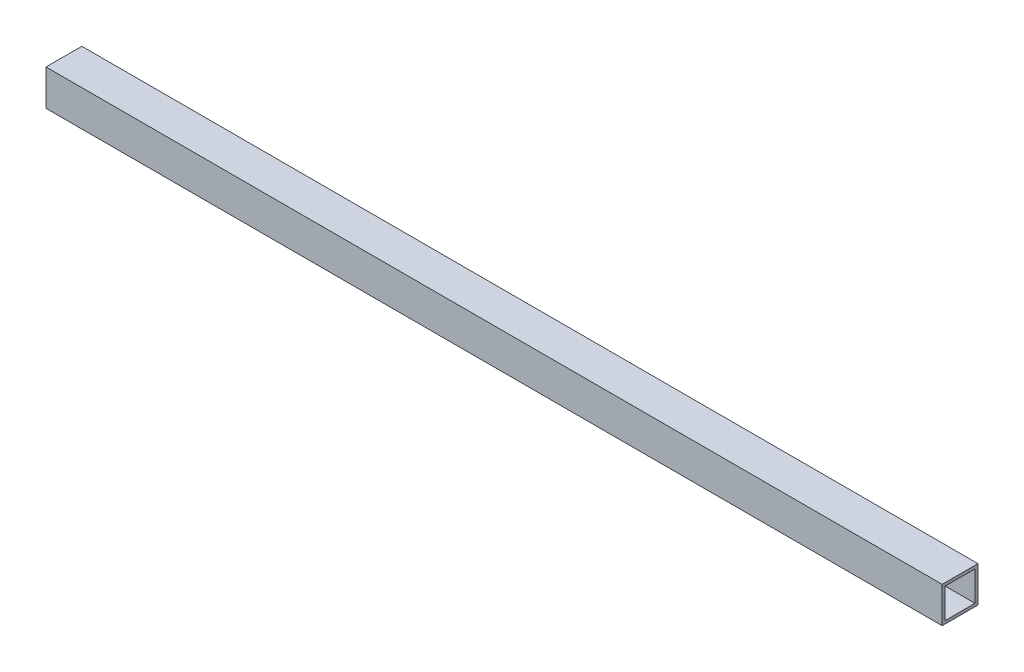
ISO-10303-21;
HEADER;
FILE_DESCRIPTION(('STEP AP214'),'2;1');
FILE_NAME('part.step','',(''),(''),'','','');
FILE_SCHEMA(('AUTOMOTIVE_DESIGN { 1 0 10303 214 1 1 1 1 }'));
ENDSEC;
DATA;
#1=APPLICATION_CONTEXT('core data for automotive mechanical design processes');
#2=APPLICATION_PROTOCOL_DEFINITION('international standard','automotive_design',2000,#1);
#3=PRODUCT_CONTEXT('',#1,'mechanical');
#4=PRODUCT('Part','Part','',(#3));
#5=PRODUCT_RELATED_PRODUCT_CATEGORY('part','',(#4));
#6=PRODUCT_DEFINITION_FORMATION('','',#4);
#7=PRODUCT_DEFINITION_CONTEXT('part definition',#1,'design');
#8=PRODUCT_DEFINITION('design','',#6,#7);
#9=PRODUCT_DEFINITION_SHAPE('','',#8);
#10=(LENGTH_UNIT() NAMED_UNIT(*) SI_UNIT(.MILLI.,.METRE.));
#11=(NAMED_UNIT(*) PLANE_ANGLE_UNIT() SI_UNIT($,.RADIAN.));
#12=(NAMED_UNIT(*) SI_UNIT($,.STERADIAN.) SOLID_ANGLE_UNIT());
#13=UNCERTAINTY_MEASURE_WITH_UNIT(LENGTH_MEASURE(1.E-05),#10,'distance_accuracy_value','');
#14=(GEOMETRIC_REPRESENTATION_CONTEXT(3) GLOBAL_UNCERTAINTY_ASSIGNED_CONTEXT((#13)) GLOBAL_UNIT_ASSIGNED_CONTEXT((#10,
#11,#12)) REPRESENTATION_CONTEXT('',''));
#15=CARTESIAN_POINT('',(0.,0.,0.));
#16=DIRECTION('',(0.,0.,1.));
#17=DIRECTION('',(1.,0.,0.));
#18=AXIS2_PLACEMENT_3D('',#15,#16,#17);
#19=CARTESIAN_POINT('',(600.,0.,0.));
#20=DIRECTION('',(1.,0.,0.));
#21=DIRECTION('',(0.,0.,-1.));
#22=AXIS2_PLACEMENT_3D('',#19,#20,#21);
#23=PLANE('',#22);
#24=DIRECTION('',(0.,0.,-1.));
#25=VECTOR('',#24,1.);
#26=CARTESIAN_POINT('',(600.,-12.,12.));
#27=LINE('',#26,#25);
#28=CARTESIAN_POINT('',(600.,-12.,12.));
#29=VERTEX_POINT('',#28);
#30=CARTESIAN_POINT('',(600.,-12.,-12.));
#31=VERTEX_POINT('',#30);
#32=EDGE_CURVE('E144',#29,#31,#27,.T.);
#33=ORIENTED_EDGE('',*,*,#32,.T.);
#34=DIRECTION('',(0.,1.,0.));
#35=VECTOR('',#34,1.);
#36=CARTESIAN_POINT('',(600.,-12.,-12.));
#37=LINE('',#36,#35);
#38=CARTESIAN_POINT('',(600.,12.,-12.));
#39=VERTEX_POINT('',#38);
#40=EDGE_CURVE('E147',#31,#39,#37,.T.);
#41=ORIENTED_EDGE('',*,*,#40,.T.);
#42=DIRECTION('',(0.,0.,1.));
#43=VECTOR('',#42,1.);
#44=CARTESIAN_POINT('',(600.,12.,12.));
#45=LINE('',#44,#43);
#46=CARTESIAN_POINT('',(600.,12.,12.));
#47=VERTEX_POINT('',#46);
#48=EDGE_CURVE('E150',#39,#47,#45,.T.);
#49=ORIENTED_EDGE('',*,*,#48,.T.);
#50=DIRECTION('',(0.,-1.,0.));
#51=VECTOR('',#50,1.);
#52=CARTESIAN_POINT('',(600.,-12.,12.));
#53=LINE('',#52,#51);
#54=EDGE_CURVE('E152',#47,#29,#53,.T.);
#55=ORIENTED_EDGE('',*,*,#54,.T.);
#56=EDGE_LOOP('',(#33,#41,#49,#55));
#57=FACE_BOUND('',#56,.T.);
#58=DIRECTION('',(0.,0.,1.));
#59=VECTOR('',#58,1.);
#60=CARTESIAN_POINT('',(600.,9.99999999999999,10.));
#61=LINE('',#60,#59);
#62=CARTESIAN_POINT('',(600.,9.99999999999999,-9.99999999999999));
#63=VERTEX_POINT('',#62);
#64=CARTESIAN_POINT('',(600.,9.99999999999999,10.));
#65=VERTEX_POINT('',#64);
#66=EDGE_CURVE('E116',#63,#65,#61,.T.);
#67=ORIENTED_EDGE('',*,*,#66,.F.);
#68=DIRECTION('',(0.,1.,0.));
#69=VECTOR('',#68,1.);
#70=CARTESIAN_POINT('',(600.,-10.,-9.99999999999999));
#71=LINE('',#70,#69);
#72=CARTESIAN_POINT('',(600.,-10.,-9.99999999999999));
#73=VERTEX_POINT('',#72);
#74=EDGE_CURVE('E108',#73,#63,#71,.T.);
#75=ORIENTED_EDGE('',*,*,#74,.F.);
#76=DIRECTION('',(0.,0.,-1.));
#77=VECTOR('',#76,1.);
#78=CARTESIAN_POINT('',(600.,-10.,10.));
#79=LINE('',#78,#77);
#80=CARTESIAN_POINT('',(600.,-10.,10.));
#81=VERTEX_POINT('',#80);
#82=EDGE_CURVE('E130',#81,#73,#79,.T.);
#83=ORIENTED_EDGE('',*,*,#82,.F.);
#84=DIRECTION('',(0.,-1.,0.));
#85=VECTOR('',#84,1.);
#86=CARTESIAN_POINT('',(600.,-10.,10.));
#87=LINE('',#86,#85);
#88=EDGE_CURVE('E128',#65,#81,#87,.T.);
#89=ORIENTED_EDGE('',*,*,#88,.F.);
#90=EDGE_LOOP('',(#67,#75,#83,#89));
#91=FACE_BOUND('',#90,.T.);
#92=ADVANCED_FACE('F43',(#57,#91),#23,.T.);
#93=CARTESIAN_POINT('',(0.,0.,0.));
#94=DIRECTION('',(1.,0.,0.));
#95=DIRECTION('',(0.,0.,-1.));
#96=AXIS2_PLACEMENT_3D('',#93,#94,#95);
#97=PLANE('',#96);
#98=DIRECTION('',(0.,0.,-1.));
#99=VECTOR('',#98,1.);
#100=CARTESIAN_POINT('',(0.,-12.,12.));
#101=LINE('',#100,#99);
#102=CARTESIAN_POINT('',(0.,-12.,12.));
#103=VERTEX_POINT('',#102);
#104=CARTESIAN_POINT('',(0.,-12.,-12.));
#105=VERTEX_POINT('',#104);
#106=EDGE_CURVE('E124',#103,#105,#101,.T.);
#107=ORIENTED_EDGE('',*,*,#106,.F.);
#108=DIRECTION('',(0.,-1.,0.));
#109=VECTOR('',#108,1.);
#110=CARTESIAN_POINT('',(0.,-12.,12.));
#111=LINE('',#110,#109);
#112=CARTESIAN_POINT('',(0.,12.,12.));
#113=VERTEX_POINT('',#112);
#114=EDGE_CURVE('E148',#113,#103,#111,.T.);
#115=ORIENTED_EDGE('',*,*,#114,.F.);
#116=DIRECTION('',(0.,0.,1.));
#117=VECTOR('',#116,1.);
#118=CARTESIAN_POINT('',(0.,12.,12.));
#119=LINE('',#118,#117);
#120=CARTESIAN_POINT('',(0.,12.,-12.));
#121=VERTEX_POINT('',#120);
#122=EDGE_CURVE('E159',#121,#113,#119,.T.);
#123=ORIENTED_EDGE('',*,*,#122,.F.);
#124=DIRECTION('',(0.,1.,0.));
#125=VECTOR('',#124,1.);
#126=CARTESIAN_POINT('',(0.,-12.,-12.));
#127=LINE('',#126,#125);
#128=EDGE_CURVE('E157',#105,#121,#127,.T.);
#129=ORIENTED_EDGE('',*,*,#128,.F.);
#130=EDGE_LOOP('',(#107,#115,#123,#129));
#131=FACE_BOUND('',#130,.T.);
#132=DIRECTION('',(0.,1.,0.));
#133=VECTOR('',#132,1.);
#134=CARTESIAN_POINT('',(0.,-10.,-9.99999999999999));
#135=LINE('',#134,#133);
#136=CARTESIAN_POINT('',(0.,-10.,-9.99999999999999));
#137=VERTEX_POINT('',#136);
#138=CARTESIAN_POINT('',(0.,9.99999999999999,-9.99999999999999));
#139=VERTEX_POINT('',#138);
#140=EDGE_CURVE('E66',#137,#139,#135,.T.);
#141=ORIENTED_EDGE('',*,*,#140,.T.);
#142=DIRECTION('',(0.,0.,1.));
#143=VECTOR('',#142,1.);
#144=CARTESIAN_POINT('',(0.,9.99999999999999,10.));
#145=LINE('',#144,#143);
#146=CARTESIAN_POINT('',(0.,9.99999999999999,10.));
#147=VERTEX_POINT('',#146);
#148=EDGE_CURVE('E123',#139,#147,#145,.T.);
#149=ORIENTED_EDGE('',*,*,#148,.T.);
#150=DIRECTION('',(0.,-1.,0.));
#151=VECTOR('',#150,1.);
#152=CARTESIAN_POINT('',(0.,-10.,10.));
#153=LINE('',#152,#151);
#154=CARTESIAN_POINT('',(0.,-10.,10.));
#155=VERTEX_POINT('',#154);
#156=EDGE_CURVE('E136',#147,#155,#153,.T.);
#157=ORIENTED_EDGE('',*,*,#156,.T.);
#158=DIRECTION('',(0.,0.,-1.));
#159=VECTOR('',#158,1.);
#160=CARTESIAN_POINT('',(0.,-10.,10.));
#161=LINE('',#160,#159);
#162=EDGE_CURVE('E117',#155,#137,#161,.T.);
#163=ORIENTED_EDGE('',*,*,#162,.T.);
#164=EDGE_LOOP('',(#141,#149,#157,#163));
#165=FACE_BOUND('',#164,.T.);
#166=ADVANCED_FACE('F177',(#131,#165),#97,.F.);
#167=CARTESIAN_POINT('',(600.,-12.,12.));
#168=DIRECTION('',(0.,1.,0.));
#169=DIRECTION('',(0.,0.,1.));
#170=AXIS2_PLACEMENT_3D('',#167,#168,#169);
#171=PLANE('',#170);
#172=ORIENTED_EDGE('',*,*,#106,.T.);
#173=DIRECTION('',(-1.,0.,0.));
#174=VECTOR('',#173,1.);
#175=CARTESIAN_POINT('',(600.,-12.,-12.));
#176=LINE('',#175,#174);
#177=EDGE_CURVE('E11',#31,#105,#176,.T.);
#178=ORIENTED_EDGE('',*,*,#177,.F.);
#179=ORIENTED_EDGE('',*,*,#32,.F.);
#180=DIRECTION('',(-1.,0.,0.));
#181=VECTOR('',#180,1.);
#182=CARTESIAN_POINT('',(600.,-12.,12.));
#183=LINE('',#182,#181);
#184=EDGE_CURVE('E154',#29,#103,#183,.T.);
#185=ORIENTED_EDGE('',*,*,#184,.T.);
#186=EDGE_LOOP('',(#172,#178,#179,#185));
#187=FACE_BOUND('',#186,.T.);
#188=ADVANCED_FACE('F45',(#187),#171,.F.);
#189=CARTESIAN_POINT('',(600.,-12.,-12.));
#190=DIRECTION('',(0.,0.,1.));
#191=DIRECTION('',(1.,0.,0.));
#192=AXIS2_PLACEMENT_3D('',#189,#190,#191);
#193=PLANE('',#192);
#194=ORIENTED_EDGE('',*,*,#128,.T.);
#195=DIRECTION('',(-1.,0.,0.));
#196=VECTOR('',#195,1.);
#197=CARTESIAN_POINT('',(600.,12.,-12.));
#198=LINE('',#197,#196);
#199=EDGE_CURVE('E51',#39,#121,#198,.T.);
#200=ORIENTED_EDGE('',*,*,#199,.F.);
#201=ORIENTED_EDGE('',*,*,#40,.F.);
#202=ORIENTED_EDGE('',*,*,#177,.T.);
#203=EDGE_LOOP('',(#194,#200,#201,#202));
#204=FACE_BOUND('',#203,.T.);
#205=ADVANCED_FACE('F187',(#204),#193,.F.);
#206=CARTESIAN_POINT('',(600.,12.,12.));
#207=DIRECTION('',(0.,-1.,0.));
#208=DIRECTION('',(0.,0.,-1.));
#209=AXIS2_PLACEMENT_3D('',#206,#207,#208);
#210=PLANE('',#209);
#211=ORIENTED_EDGE('',*,*,#122,.T.);
#212=DIRECTION('',(-1.,0.,0.));
#213=VECTOR('',#212,1.);
#214=CARTESIAN_POINT('',(600.,12.,12.));
#215=LINE('',#214,#213);
#216=EDGE_CURVE('E164',#47,#113,#215,.T.);
#217=ORIENTED_EDGE('',*,*,#216,.F.);
#218=ORIENTED_EDGE('',*,*,#48,.F.);
#219=ORIENTED_EDGE('',*,*,#199,.T.);
#220=EDGE_LOOP('',(#211,#217,#218,#219));
#221=FACE_BOUND('',#220,.T.);
#222=ADVANCED_FACE('F171',(#221),#210,.F.);
#223=CARTESIAN_POINT('',(600.,-12.,12.));
#224=DIRECTION('',(0.,0.,-1.));
#225=DIRECTION('',(-1.,0.,0.));
#226=AXIS2_PLACEMENT_3D('',#223,#224,#225);
#227=PLANE('',#226);
#228=ORIENTED_EDGE('',*,*,#114,.T.);
#229=ORIENTED_EDGE('',*,*,#184,.F.);
#230=ORIENTED_EDGE('',*,*,#54,.F.);
#231=ORIENTED_EDGE('',*,*,#216,.T.);
#232=EDGE_LOOP('',(#228,#229,#230,#231));
#233=FACE_BOUND('',#232,.T.);
#234=ADVANCED_FACE('F181',(#233),#227,.F.);
#235=CARTESIAN_POINT('',(600.,-10.,-9.99999999999999));
#236=DIRECTION('',(0.,0.,1.));
#237=DIRECTION('',(1.,0.,0.));
#238=AXIS2_PLACEMENT_3D('',#235,#236,#237);
#239=PLANE('',#238);
#240=ORIENTED_EDGE('',*,*,#140,.F.);
#241=DIRECTION('',(-1.,0.,0.));
#242=VECTOR('',#241,1.);
#243=CARTESIAN_POINT('',(600.,-10.,-9.99999999999999));
#244=LINE('',#243,#242);
#245=EDGE_CURVE('E112',#73,#137,#244,.T.);
#246=ORIENTED_EDGE('',*,*,#245,.F.);
#247=ORIENTED_EDGE('',*,*,#74,.T.);
#248=DIRECTION('',(-1.,0.,0.));
#249=VECTOR('',#248,1.);
#250=CARTESIAN_POINT('',(600.,9.99999999999999,-9.99999999999999));
#251=LINE('',#250,#249);
#252=EDGE_CURVE('E111',#63,#139,#251,.T.);
#253=ORIENTED_EDGE('',*,*,#252,.T.);
#254=EDGE_LOOP('',(#240,#246,#247,#253));
#255=FACE_BOUND('',#254,.T.);
#256=ADVANCED_FACE('F110',(#255),#239,.T.);
#257=CARTESIAN_POINT('',(600.,9.99999999999999,10.));
#258=DIRECTION('',(0.,-1.,0.));
#259=DIRECTION('',(0.,0.,-1.));
#260=AXIS2_PLACEMENT_3D('',#257,#258,#259);
#261=PLANE('',#260);
#262=ORIENTED_EDGE('',*,*,#148,.F.);
#263=ORIENTED_EDGE('',*,*,#252,.F.);
#264=ORIENTED_EDGE('',*,*,#66,.T.);
#265=DIRECTION('',(-1.,0.,0.));
#266=VECTOR('',#265,1.);
#267=CARTESIAN_POINT('',(600.,9.99999999999999,10.));
#268=LINE('',#267,#266);
#269=EDGE_CURVE('E125',#65,#147,#268,.T.);
#270=ORIENTED_EDGE('',*,*,#269,.T.);
#271=EDGE_LOOP('',(#262,#263,#264,#270));
#272=FACE_BOUND('',#271,.T.);
#273=ADVANCED_FACE('F120',(#272),#261,.T.);
#274=CARTESIAN_POINT('',(600.,-10.,10.));
#275=DIRECTION('',(0.,0.,-1.));
#276=DIRECTION('',(-1.,0.,0.));
#277=AXIS2_PLACEMENT_3D('',#274,#275,#276);
#278=PLANE('',#277);
#279=ORIENTED_EDGE('',*,*,#156,.F.);
#280=ORIENTED_EDGE('',*,*,#269,.F.);
#281=ORIENTED_EDGE('',*,*,#88,.T.);
#282=DIRECTION('',(-1.,0.,0.));
#283=VECTOR('',#282,1.);
#284=CARTESIAN_POINT('',(600.,-10.,10.));
#285=LINE('',#284,#283);
#286=EDGE_CURVE('E58',#81,#155,#285,.T.);
#287=ORIENTED_EDGE('',*,*,#286,.T.);
#288=EDGE_LOOP('',(#279,#280,#281,#287));
#289=FACE_BOUND('',#288,.T.);
#290=ADVANCED_FACE('F210',(#289),#278,.T.);
#291=CARTESIAN_POINT('',(600.,-10.,10.));
#292=DIRECTION('',(0.,1.,0.));
#293=DIRECTION('',(0.,0.,1.));
#294=AXIS2_PLACEMENT_3D('',#291,#292,#293);
#295=PLANE('',#294);
#296=ORIENTED_EDGE('',*,*,#162,.F.);
#297=ORIENTED_EDGE('',*,*,#286,.F.);
#298=ORIENTED_EDGE('',*,*,#82,.T.);
#299=ORIENTED_EDGE('',*,*,#245,.T.);
#300=EDGE_LOOP('',(#296,#297,#298,#299));
#301=FACE_BOUND('',#300,.T.);
#302=ADVANCED_FACE('F214',(#301),#295,.T.);
#303=CLOSED_SHELL('',(#92,#166,#188,#205,#222,#234,#256,#273,#290,#302));
#304=MANIFOLD_SOLID_BREP('B2',#303);
#305=ADVANCED_BREP_SHAPE_REPRESENTATION('',(#18,#304),#14);
#306=SHAPE_DEFINITION_REPRESENTATION(#9,#305);
ENDSEC;
END-ISO-10303-21;
